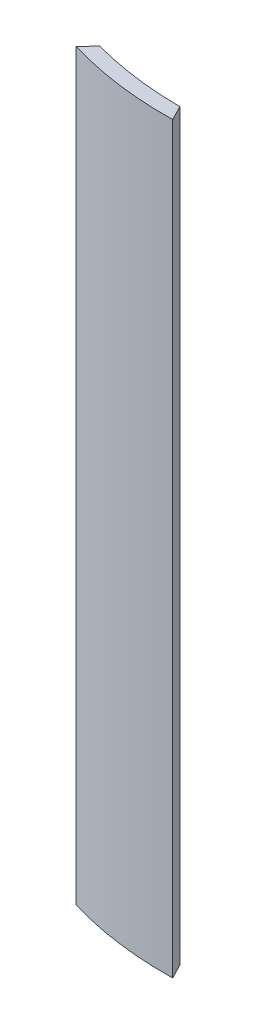
ISO-10303-21;
HEADER;
FILE_DESCRIPTION(('STEP AP214'),'2;1');
FILE_NAME('part.step','',(''),(''),'','','');
FILE_SCHEMA(('AUTOMOTIVE_DESIGN { 1 0 10303 214 1 1 1 1 }'));
ENDSEC;
DATA;
#1=APPLICATION_CONTEXT('core data for automotive mechanical design processes');
#2=APPLICATION_PROTOCOL_DEFINITION('international standard','automotive_design',2000,#1);
#3=PRODUCT_CONTEXT('',#1,'mechanical');
#4=PRODUCT('Part','Part','',(#3));
#5=PRODUCT_RELATED_PRODUCT_CATEGORY('part','',(#4));
#6=PRODUCT_DEFINITION_FORMATION('','',#4);
#7=PRODUCT_DEFINITION_CONTEXT('part definition',#1,'design');
#8=PRODUCT_DEFINITION('design','',#6,#7);
#9=PRODUCT_DEFINITION_SHAPE('','',#8);
#10=(LENGTH_UNIT() NAMED_UNIT(*) SI_UNIT(.MILLI.,.METRE.));
#11=(NAMED_UNIT(*) PLANE_ANGLE_UNIT() SI_UNIT($,.RADIAN.));
#12=(NAMED_UNIT(*) SI_UNIT($,.STERADIAN.) SOLID_ANGLE_UNIT());
#13=UNCERTAINTY_MEASURE_WITH_UNIT(LENGTH_MEASURE(1.E-05),#10,'distance_accuracy_value','');
#14=(GEOMETRIC_REPRESENTATION_CONTEXT(3) GLOBAL_UNCERTAINTY_ASSIGNED_CONTEXT((#13)) GLOBAL_UNIT_ASSIGNED_CONTEXT((#10,
#11,#12)) REPRESENTATION_CONTEXT('',''));
#15=CARTESIAN_POINT('',(0.,0.,0.));
#16=DIRECTION('',(0.,0.,1.));
#17=DIRECTION('',(1.,0.,0.));
#18=AXIS2_PLACEMENT_3D('',#15,#16,#17);
#19=CARTESIAN_POINT('',(2.55784382791541,30.,-19.1758589373486));
#20=DIRECTION('',(0.,-1.,0.));
#21=DIRECTION('',(0.,0.,-1.));
#22=AXIS2_PLACEMENT_3D('',#19,#20,#21);
#23=CYLINDRICAL_SURFACE('',#22,23.75);
#24=CARTESIAN_POINT('',(2.55784382791541,-20.,-19.1758589373486));
#25=DIRECTION('',(0.,-1.,0.));
#26=DIRECTION('',(0.,0.,1.));
#27=AXIS2_PLACEMENT_3D('',#24,#25,#26);
#28=CIRCLE('',#27,23.75);
#29=CARTESIAN_POINT('',(2.55784382791541,-20.,4.5741410626514));
#30=VERTEX_POINT('',#29);
#31=CARTESIAN_POINT('',(-3.66735944101374,-20.,3.74376898852564));
#32=VERTEX_POINT('',#31);
#33=EDGE_CURVE('E108',#30,#32,#28,.T.);
#34=ORIENTED_EDGE('',*,*,#33,.T.);
#35=DIRECTION('',(0.,-1.,0.));
#36=VECTOR('',#35,1.);
#37=CARTESIAN_POINT('',(-3.66735944101374,30.,3.74376898852564));
#38=LINE('',#37,#36);
#39=CARTESIAN_POINT('',(-3.66735944101374,30.,3.74376898852564));
#40=VERTEX_POINT('',#39);
#41=EDGE_CURVE('E11',#40,#32,#38,.T.);
#42=ORIENTED_EDGE('',*,*,#41,.F.);
#43=CARTESIAN_POINT('',(2.55784382791541,30.,-19.1758589373486));
#44=DIRECTION('',(0.,-1.,0.));
#45=DIRECTION('',(0.,0.,1.));
#46=AXIS2_PLACEMENT_3D('',#43,#44,#45);
#47=CIRCLE('',#46,23.75);
#48=CARTESIAN_POINT('',(2.55784382791541,30.,4.5741410626514));
#49=VERTEX_POINT('',#48);
#50=EDGE_CURVE('E92',#49,#40,#47,.T.);
#51=ORIENTED_EDGE('',*,*,#50,.F.);
#52=DIRECTION('',(0.,-1.,0.));
#53=VECTOR('',#52,1.);
#54=CARTESIAN_POINT('',(2.55784382791541,30.,4.5741410626514));
#55=LINE('',#54,#53);
#56=EDGE_CURVE('E104',#49,#30,#55,.T.);
#57=ORIENTED_EDGE('',*,*,#56,.T.);
#58=EDGE_LOOP('',(#34,#42,#51,#57));
#59=FACE_BOUND('',#58,.T.);
#60=ADVANCED_FACE('F40',(#59),#23,.F.);
#61=CARTESIAN_POINT('',(-3.66735944101374,30.,3.74376898852564));
#62=DIRECTION('',(0.737106209511214,0.,0.675776912819615));
#63=DIRECTION('',(0.675776912819615,0.,-0.737106209511214));
#64=AXIS2_PLACEMENT_3D('',#61,#62,#63);
#65=PLANE('',#64);
#66=DIRECTION('',(-0.675776912819615,0.,0.737106209511214));
#67=VECTOR('',#66,1.);
#68=CARTESIAN_POINT('',(-3.66735944101374,-20.,3.74376898852564));
#69=LINE('',#68,#67);
#70=CARTESIAN_POINT('',(-4.4239140735556,-20.,4.56898379965953));
#71=VERTEX_POINT('',#70);
#72=EDGE_CURVE('E97',#32,#71,#69,.T.);
#73=ORIENTED_EDGE('',*,*,#72,.T.);
#74=DIRECTION('',(0.,-1.,0.));
#75=VECTOR('',#74,1.);
#76=CARTESIAN_POINT('',(-4.4239140735556,30.,4.56898379965953));
#77=LINE('',#76,#75);
#78=CARTESIAN_POINT('',(-4.4239140735556,30.,4.56898379965953));
#79=VERTEX_POINT('',#78);
#80=EDGE_CURVE('E49',#79,#71,#77,.T.);
#81=ORIENTED_EDGE('',*,*,#80,.F.);
#82=DIRECTION('',(-0.675776912819615,0.,0.737106209511214));
#83=VECTOR('',#82,1.);
#84=CARTESIAN_POINT('',(-3.66735944101374,30.,3.74376898852564));
#85=LINE('',#84,#83);
#86=EDGE_CURVE('E87',#40,#79,#85,.T.);
#87=ORIENTED_EDGE('',*,*,#86,.F.);
#88=ORIENTED_EDGE('',*,*,#41,.T.);
#89=EDGE_LOOP('',(#73,#81,#87,#88));
#90=FACE_BOUND('',#89,.T.);
#91=ADVANCED_FACE('F96',(#90),#65,.F.);
#92=CARTESIAN_POINT('',(2.55784382791541,30.,-19.1758589373486));
#93=DIRECTION('',(0.,-1.,0.));
#94=DIRECTION('',(0.,0.,-1.));
#95=AXIS2_PLACEMENT_3D('',#92,#93,#94);
#96=CYLINDRICAL_SURFACE('',#95,24.75);
#97=CARTESIAN_POINT('',(2.55784382791541,-20.,-19.1758589373486));
#98=DIRECTION('',(0.,1.,0.));
#99=DIRECTION('',(0.,0.,1.));
#100=AXIS2_PLACEMENT_3D('',#97,#98,#99);
#101=CIRCLE('',#100,24.75);
#102=CARTESIAN_POINT('',(3.07164680659399,-20.,5.56880728588225));
#103=VERTEX_POINT('',#102);
#104=EDGE_CURVE('E74',#71,#103,#101,.T.);
#105=ORIENTED_EDGE('',*,*,#104,.T.);
#106=DIRECTION('',(0.,-1.,0.));
#107=VECTOR('',#106,1.);
#108=CARTESIAN_POINT('',(3.07164680659399,30.,5.56880728588225));
#109=LINE('',#108,#107);
#110=CARTESIAN_POINT('',(3.07164680659399,30.,5.56880728588225));
#111=VERTEX_POINT('',#110);
#112=EDGE_CURVE('E99',#111,#103,#109,.T.);
#113=ORIENTED_EDGE('',*,*,#112,.F.);
#114=CARTESIAN_POINT('',(2.55784382791541,30.,-19.1758589373486));
#115=DIRECTION('',(0.,1.,0.));
#116=DIRECTION('',(0.,0.,1.));
#117=AXIS2_PLACEMENT_3D('',#114,#115,#116);
#118=CIRCLE('',#117,24.75);
#119=EDGE_CURVE('E90',#79,#111,#118,.T.);
#120=ORIENTED_EDGE('',*,*,#119,.F.);
#121=ORIENTED_EDGE('',*,*,#80,.T.);
#122=EDGE_LOOP('',(#105,#113,#120,#121));
#123=FACE_BOUND('',#122,.T.);
#124=ADVANCED_FACE('F100',(#123),#96,.T.);
#125=CARTESIAN_POINT('',(2.55784382791541,30.,4.5741410626514));
#126=DIRECTION('',(-0.888465208867372,0.,0.458943975483126));
#127=DIRECTION('',(0.458943975483126,0.,0.888465208867372));
#128=AXIS2_PLACEMENT_3D('',#125,#126,#127);
#129=PLANE('',#128);
#130=DIRECTION('',(-0.458943975483126,0.,-0.888465208867372));
#131=VECTOR('',#130,1.);
#132=CARTESIAN_POINT('',(2.55784382791541,-20.,4.5741410626514));
#133=LINE('',#132,#131);
#134=EDGE_CURVE('E80',#103,#30,#133,.T.);
#135=ORIENTED_EDGE('',*,*,#134,.T.);
#136=ORIENTED_EDGE('',*,*,#56,.F.);
#137=DIRECTION('',(-0.458943975483126,0.,-0.888465208867372));
#138=VECTOR('',#137,1.);
#139=CARTESIAN_POINT('',(2.55784382791541,30.,4.5741410626514));
#140=LINE('',#139,#138);
#141=EDGE_CURVE('E57',#111,#49,#140,.T.);
#142=ORIENTED_EDGE('',*,*,#141,.F.);
#143=ORIENTED_EDGE('',*,*,#112,.T.);
#144=EDGE_LOOP('',(#135,#136,#142,#143));
#145=FACE_BOUND('',#144,.T.);
#146=ADVANCED_FACE('F121',(#145),#129,.F.);
#147=CARTESIAN_POINT('',(2.55784382791541,30.,-19.1758589373486));
#148=DIRECTION('',(0.,1.,0.));
#149=DIRECTION('',(0.,0.,1.));
#150=AXIS2_PLACEMENT_3D('',#147,#148,#149);
#151=PLANE('',#150);
#152=ORIENTED_EDGE('',*,*,#50,.T.);
#153=ORIENTED_EDGE('',*,*,#86,.T.);
#154=ORIENTED_EDGE('',*,*,#119,.T.);
#155=ORIENTED_EDGE('',*,*,#141,.T.);
#156=EDGE_LOOP('',(#152,#153,#154,#155));
#157=FACE_BOUND('',#156,.T.);
#158=ADVANCED_FACE('F88',(#157),#151,.T.);
#159=CARTESIAN_POINT('',(2.55784382791541,-20.,-19.1758589373486));
#160=DIRECTION('',(0.,1.,0.));
#161=DIRECTION('',(0.,0.,1.));
#162=AXIS2_PLACEMENT_3D('',#159,#160,#161);
#163=PLANE('',#162);
#164=ORIENTED_EDGE('',*,*,#33,.F.);
#165=ORIENTED_EDGE('',*,*,#134,.F.);
#166=ORIENTED_EDGE('',*,*,#104,.F.);
#167=ORIENTED_EDGE('',*,*,#72,.F.);
#168=EDGE_LOOP('',(#164,#165,#166,#167));
#169=FACE_BOUND('',#168,.T.);
#170=ADVANCED_FACE('F124',(#169),#163,.F.);
#171=CLOSED_SHELL('',(#60,#91,#124,#146,#158,#170));
#172=MANIFOLD_SOLID_BREP('B2',#171);
#173=ADVANCED_BREP_SHAPE_REPRESENTATION('',(#18,#172),#14);
#174=SHAPE_DEFINITION_REPRESENTATION(#9,#173);
ENDSEC;
END-ISO-10303-21;
